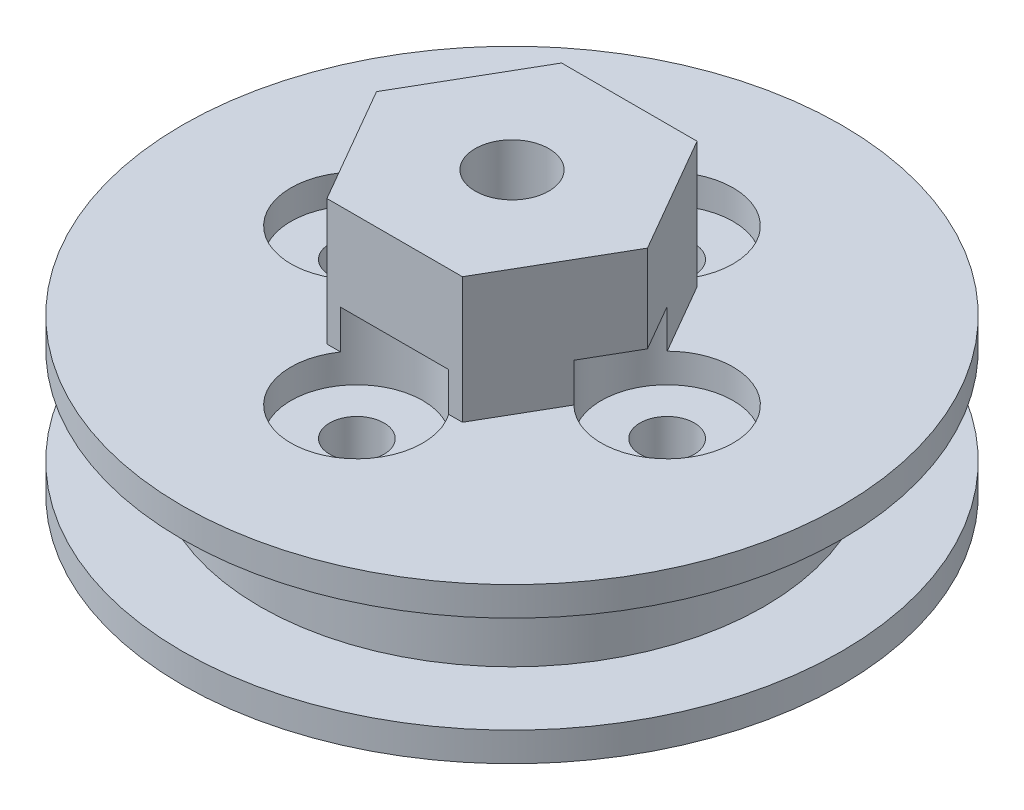
ISO-10303-21;
HEADER;
FILE_DESCRIPTION(('STEP AP214'),'2;1');
FILE_NAME('part.step','',(''),(''),'','','');
FILE_SCHEMA(('AUTOMOTIVE_DESIGN { 1 0 10303 214 1 1 1 1 }'));
ENDSEC;
DATA;
#1=APPLICATION_CONTEXT('core data for automotive mechanical design processes');
#2=APPLICATION_PROTOCOL_DEFINITION('international standard','automotive_design',2000,#1);
#3=PRODUCT_CONTEXT('',#1,'mechanical');
#4=PRODUCT('Part','Part','',(#3));
#5=PRODUCT_RELATED_PRODUCT_CATEGORY('part','',(#4));
#6=PRODUCT_DEFINITION_FORMATION('','',#4);
#7=PRODUCT_DEFINITION_CONTEXT('part definition',#1,'design');
#8=PRODUCT_DEFINITION('design','',#6,#7);
#9=PRODUCT_DEFINITION_SHAPE('','',#8);
#10=(LENGTH_UNIT() NAMED_UNIT(*) SI_UNIT(.MILLI.,.METRE.));
#11=(NAMED_UNIT(*) PLANE_ANGLE_UNIT() SI_UNIT($,.RADIAN.));
#12=(NAMED_UNIT(*) SI_UNIT($,.STERADIAN.) SOLID_ANGLE_UNIT());
#13=UNCERTAINTY_MEASURE_WITH_UNIT(LENGTH_MEASURE(1.E-05),#10,'distance_accuracy_value','');
#14=(GEOMETRIC_REPRESENTATION_CONTEXT(3) GLOBAL_UNCERTAINTY_ASSIGNED_CONTEXT((#13)) GLOBAL_UNIT_ASSIGNED_CONTEXT((#10,
#11,#12)) REPRESENTATION_CONTEXT('',''));
#15=CARTESIAN_POINT('',(0.,0.,0.));
#16=DIRECTION('',(0.,0.,1.));
#17=DIRECTION('',(1.,0.,0.));
#18=AXIS2_PLACEMENT_3D('',#15,#16,#17);
#19=CARTESIAN_POINT('',(0.,8.,0.));
#20=DIRECTION('',(0.,-1.,0.));
#21=DIRECTION('',(0.,0.,1.));
#22=AXIS2_PLACEMENT_3D('',#19,#20,#21);
#23=CYLINDRICAL_SURFACE('',#22,17.);
#24=CARTESIAN_POINT('',(0.,1.5,0.));
#25=DIRECTION('',(0.,-1.,0.));
#26=DIRECTION('',(0.,0.,-1.));
#27=AXIS2_PLACEMENT_3D('',#24,#25,#26);
#28=CIRCLE('',#27,17.);
#29=CARTESIAN_POINT('',(0.,1.5,-17.));
#30=VERTEX_POINT('',#29);
#31=EDGE_CURVE('E199',#30,#30,#28,.T.);
#32=ORIENTED_EDGE('',*,*,#31,.T.);
#33=EDGE_LOOP('',(#32));
#34=FACE_BOUND('',#33,.T.);
#35=CARTESIAN_POINT('',(0.,0.,0.));
#36=DIRECTION('',(0.,-1.,0.));
#37=DIRECTION('',(0.,0.,-1.));
#38=AXIS2_PLACEMENT_3D('',#35,#36,#37);
#39=CIRCLE('',#38,17.);
#40=CARTESIAN_POINT('',(0.,0.,-17.));
#41=VERTEX_POINT('',#40);
#42=EDGE_CURVE('E47',#41,#41,#39,.T.);
#43=ORIENTED_EDGE('',*,*,#42,.F.);
#44=EDGE_LOOP('',(#43));
#45=FACE_BOUND('',#44,.T.);
#46=ADVANCED_FACE('F43',(#34,#45),#23,.T.);
#47=CARTESIAN_POINT('',(0.,8.,8.));
#48=DIRECTION('',(0.,-1.,0.));
#49=DIRECTION('',(0.,0.,1.));
#50=AXIS2_PLACEMENT_3D('',#47,#48,#49);
#51=CYLINDRICAL_SURFACE('',#50,1.4);
#52=CARTESIAN_POINT('',(0.,0.,8.));
#53=DIRECTION('',(0.,-1.,0.));
#54=DIRECTION('',(0.,0.,-1.));
#55=AXIS2_PLACEMENT_3D('',#52,#53,#54);
#56=CIRCLE('',#55,1.4);
#57=CARTESIAN_POINT('',(0.,0.,6.6));
#58=VERTEX_POINT('',#57);
#59=EDGE_CURVE('E296',#58,#58,#56,.T.);
#60=ORIENTED_EDGE('',*,*,#59,.T.);
#61=EDGE_LOOP('',(#60));
#62=FACE_BOUND('',#61,.T.);
#63=CARTESIAN_POINT('',(0.,6.5,8.));
#64=DIRECTION('',(0.,-1.,0.));
#65=DIRECTION('',(0.,0.,-1.));
#66=AXIS2_PLACEMENT_3D('',#63,#64,#65);
#67=CIRCLE('',#66,1.4);
#68=CARTESIAN_POINT('',(0.,6.5,6.6));
#69=VERTEX_POINT('',#68);
#70=EDGE_CURVE('E281',#69,#69,#67,.F.);
#71=ORIENTED_EDGE('',*,*,#70,.T.);
#72=EDGE_LOOP('',(#71));
#73=FACE_BOUND('',#72,.T.);
#74=ADVANCED_FACE('F315',(#62,#73),#51,.F.);
#75=CARTESIAN_POINT('',(8.,8.,0.));
#76=DIRECTION('',(0.,-1.,0.));
#77=DIRECTION('',(0.,0.,1.));
#78=AXIS2_PLACEMENT_3D('',#75,#76,#77);
#79=CYLINDRICAL_SURFACE('',#78,1.4);
#80=CARTESIAN_POINT('',(8.,0.,0.));
#81=DIRECTION('',(0.,-1.,0.));
#82=DIRECTION('',(0.,0.,-1.));
#83=AXIS2_PLACEMENT_3D('',#80,#81,#82);
#84=CIRCLE('',#83,1.4);
#85=CARTESIAN_POINT('',(8.,0.,-1.40000000000003));
#86=VERTEX_POINT('',#85);
#87=EDGE_CURVE('E293',#86,#86,#84,.T.);
#88=ORIENTED_EDGE('',*,*,#87,.T.);
#89=EDGE_LOOP('',(#88));
#90=FACE_BOUND('',#89,.T.);
#91=CARTESIAN_POINT('',(8.,6.5,0.));
#92=DIRECTION('',(0.,-1.,0.));
#93=DIRECTION('',(0.,0.,-1.));
#94=AXIS2_PLACEMENT_3D('',#91,#92,#93);
#95=CIRCLE('',#94,1.4);
#96=CARTESIAN_POINT('',(8.,6.5,-1.40000000000003));
#97=VERTEX_POINT('',#96);
#98=EDGE_CURVE('E264',#97,#97,#95,.F.);
#99=ORIENTED_EDGE('',*,*,#98,.T.);
#100=EDGE_LOOP('',(#99));
#101=FACE_BOUND('',#100,.T.);
#102=ADVANCED_FACE('F320',(#90,#101),#79,.F.);
#103=CARTESIAN_POINT('',(4.51808198568511E-13,8.,-8.));
#104=DIRECTION('',(0.,-1.,0.));
#105=DIRECTION('',(0.,0.,1.));
#106=AXIS2_PLACEMENT_3D('',#103,#104,#105);
#107=CYLINDRICAL_SURFACE('',#106,1.4);
#108=CARTESIAN_POINT('',(4.51808198568511E-13,0.,-8.));
#109=DIRECTION('',(0.,-1.,0.));
#110=DIRECTION('',(0.,0.,-1.));
#111=AXIS2_PLACEMENT_3D('',#108,#109,#110);
#112=CIRCLE('',#111,1.4);
#113=CARTESIAN_POINT('',(4.51808198568511E-13,0.,-9.4));
#114=VERTEX_POINT('',#113);
#115=EDGE_CURVE('E290',#114,#114,#112,.T.);
#116=ORIENTED_EDGE('',*,*,#115,.T.);
#117=EDGE_LOOP('',(#116));
#118=FACE_BOUND('',#117,.T.);
#119=CARTESIAN_POINT('',(4.51808198568511E-13,6.5,-8.));
#120=DIRECTION('',(0.,-1.,0.));
#121=DIRECTION('',(0.,0.,-1.));
#122=AXIS2_PLACEMENT_3D('',#119,#120,#121);
#123=CIRCLE('',#122,1.4);
#124=CARTESIAN_POINT('',(4.51808198568511E-13,6.5,-9.4));
#125=VERTEX_POINT('',#124);
#126=EDGE_CURVE('E256',#125,#125,#123,.F.);
#127=ORIENTED_EDGE('',*,*,#126,.T.);
#128=EDGE_LOOP('',(#127));
#129=FACE_BOUND('',#128,.T.);
#130=ADVANCED_FACE('F441',(#118,#129),#107,.F.);
#131=CARTESIAN_POINT('',(-7.99999999999977,8.,-2.26883816723573E-13));
#132=DIRECTION('',(0.,-1.,0.));
#133=DIRECTION('',(0.,0.,1.));
#134=AXIS2_PLACEMENT_3D('',#131,#132,#133);
#135=CYLINDRICAL_SURFACE('',#134,1.4);
#136=CARTESIAN_POINT('',(-7.99999999999977,0.,-2.26883816723573E-13));
#137=DIRECTION('',(0.,-1.,0.));
#138=DIRECTION('',(0.,0.,-1.));
#139=AXIS2_PLACEMENT_3D('',#136,#137,#138);
#140=CIRCLE('',#139,1.4);
#141=CARTESIAN_POINT('',(-7.99999999999977,0.,-1.40000000000023));
#142=VERTEX_POINT('',#141);
#143=EDGE_CURVE('E263',#142,#142,#140,.T.);
#144=ORIENTED_EDGE('',*,*,#143,.T.);
#145=EDGE_LOOP('',(#144));
#146=FACE_BOUND('',#145,.T.);
#147=CARTESIAN_POINT('',(-7.99999999999977,6.5,-2.26883816723573E-13));
#148=DIRECTION('',(0.,-1.,0.));
#149=DIRECTION('',(0.,0.,-1.));
#150=AXIS2_PLACEMENT_3D('',#147,#148,#149);
#151=CIRCLE('',#150,1.4);
#152=CARTESIAN_POINT('',(-7.99999999999977,6.5,-1.40000000000023));
#153=VERTEX_POINT('',#152);
#154=EDGE_CURVE('E273',#153,#153,#151,.F.);
#155=ORIENTED_EDGE('',*,*,#154,.T.);
#156=EDGE_LOOP('',(#155));
#157=FACE_BOUND('',#156,.T.);
#158=ADVANCED_FACE('F438',(#146,#157),#135,.F.);
#159=CARTESIAN_POINT('',(0.,8.,0.));
#160=DIRECTION('',(0.,1.,0.));
#161=DIRECTION('',(0.,0.,-1.));
#162=AXIS2_PLACEMENT_3D('',#159,#160,#161);
#163=PLANE('',#162);
#164=DIRECTION('',(1.,0.,0.));
#165=VECTOR('',#164,1.);
#166=CARTESIAN_POINT('',(-3.49296912859723,8.,-6.05));
#167=LINE('',#166,#165);
#168=CARTESIAN_POINT('',(-3.49296912859723,8.,-6.05));
#169=VERTEX_POINT('',#168);
#170=CARTESIAN_POINT('',(-2.78522889544064,8.,-6.05));
#171=VERTEX_POINT('',#170);
#172=EDGE_CURVE('E204',#169,#171,#167,.T.);
#173=ORIENTED_EDGE('',*,*,#172,.T.);
#174=CARTESIAN_POINT('',(4.51808198568511E-13,8.,-8.));
#175=DIRECTION('',(0.,-1.,0.));
#176=DIRECTION('',(0.,0.,-1.));
#177=AXIS2_PLACEMENT_3D('',#174,#175,#176);
#178=CIRCLE('',#177,3.4);
#179=CARTESIAN_POINT('',(2.78522889544154,8.,-6.05));
#180=VERTEX_POINT('',#179);
#181=EDGE_CURVE('E257',#171,#180,#178,.T.);
#182=ORIENTED_EDGE('',*,*,#181,.T.);
#183=CARTESIAN_POINT('',(3.49296912859723,8.,-6.05));
#184=VERTEX_POINT('',#183);
#185=EDGE_CURVE('E229',#180,#184,#167,.T.);
#186=ORIENTED_EDGE('',*,*,#185,.T.);
#187=DIRECTION('',(0.5,0.,0.866025403784438));
#188=VECTOR('',#187,1.);
#189=CARTESIAN_POINT('',(3.49296912859723,8.,-6.05));
#190=LINE('',#189,#188);
#191=CARTESIAN_POINT('',(5.59714136828051,8.,-2.40546677299257));
#192=VERTEX_POINT('',#191);
#193=EDGE_CURVE('E228',#184,#192,#190,.T.);
#194=ORIENTED_EDGE('',*,*,#193,.T.);
#195=CARTESIAN_POINT('',(8.,8.,0.));
#196=DIRECTION('',(0.,-1.,0.));
#197=DIRECTION('',(0.,0.,-1.));
#198=AXIS2_PLACEMENT_3D('',#195,#196,#197);
#199=CIRCLE('',#198,3.4);
#200=CARTESIAN_POINT('',(5.59714136828053,8.,2.40546677299253));
#201=VERTEX_POINT('',#200);
#202=EDGE_CURVE('E260',#192,#201,#199,.T.);
#203=ORIENTED_EDGE('',*,*,#202,.T.);
#204=DIRECTION('',(-0.5,0.,0.866025403784438));
#205=VECTOR('',#204,1.);
#206=CARTESIAN_POINT('',(6.98593825719447,8.,0.));
#207=LINE('',#206,#205);
#208=CARTESIAN_POINT('',(3.49296912859723,8.,6.05));
#209=VERTEX_POINT('',#208);
#210=EDGE_CURVE('E233',#201,#209,#207,.T.);
#211=ORIENTED_EDGE('',*,*,#210,.T.);
#212=DIRECTION('',(-1.,0.,0.));
#213=VECTOR('',#212,1.);
#214=CARTESIAN_POINT('',(3.49296912859723,8.,6.05));
#215=LINE('',#214,#213);
#216=CARTESIAN_POINT('',(2.78522889544109,8.,6.05));
#217=VERTEX_POINT('',#216);
#218=EDGE_CURVE('E232',#209,#217,#215,.T.);
#219=ORIENTED_EDGE('',*,*,#218,.T.);
#220=CARTESIAN_POINT('',(0.,8.,8.));
#221=DIRECTION('',(0.,-1.,0.));
#222=DIRECTION('',(0.,0.,-1.));
#223=AXIS2_PLACEMENT_3D('',#220,#221,#222);
#224=CIRCLE('',#223,3.4);
#225=CARTESIAN_POINT('',(-2.78522889544109,8.,6.05));
#226=VERTEX_POINT('',#225);
#227=EDGE_CURVE('E165',#217,#226,#224,.T.);
#228=ORIENTED_EDGE('',*,*,#227,.T.);
#229=CARTESIAN_POINT('',(-3.49296912859724,8.,6.05));
#230=VERTEX_POINT('',#229);
#231=EDGE_CURVE('E52',#226,#230,#215,.T.);
#232=ORIENTED_EDGE('',*,*,#231,.T.);
#233=DIRECTION('',(-0.5,0.,-0.866025403784438));
#234=VECTOR('',#233,1.);
#235=CARTESIAN_POINT('',(-3.49296912859724,8.,6.05));
#236=LINE('',#235,#234);
#237=CARTESIAN_POINT('',(-5.59714136828052,8.,2.40546677299255));
#238=VERTEX_POINT('',#237);
#239=EDGE_CURVE('E210',#230,#238,#236,.T.);
#240=ORIENTED_EDGE('',*,*,#239,.T.);
#241=CARTESIAN_POINT('',(-7.99999999999977,8.,-2.26883816723573E-13));
#242=DIRECTION('',(0.,-1.,0.));
#243=DIRECTION('',(0.,0.,-1.));
#244=AXIS2_PLACEMENT_3D('',#241,#242,#243);
#245=CIRCLE('',#244,3.4);
#246=CARTESIAN_POINT('',(-5.59714136828036,8.,-2.40546677299284));
#247=VERTEX_POINT('',#246);
#248=EDGE_CURVE('E268',#238,#247,#245,.T.);
#249=ORIENTED_EDGE('',*,*,#248,.T.);
#250=DIRECTION('',(0.5,0.,-0.866025403784438));
#251=VECTOR('',#250,1.);
#252=CARTESIAN_POINT('',(-6.98593825719447,8.,0.));
#253=LINE('',#252,#251);
#254=EDGE_CURVE('E12',#247,#169,#253,.T.);
#255=ORIENTED_EDGE('',*,*,#254,.T.);
#256=EDGE_LOOP('',(#173,#182,#186,#194,#203,#211,#219,#228,#232,#240,#249,#255));
#257=FACE_BOUND('',#256,.T.);
#258=CARTESIAN_POINT('',(0.,8.,0.));
#259=DIRECTION('',(0.,-1.,0.));
#260=DIRECTION('',(0.,0.,-1.));
#261=AXIS2_PLACEMENT_3D('',#258,#259,#260);
#262=CIRCLE('',#261,17.);
#263=CARTESIAN_POINT('',(0.,8.,-17.));
#264=VERTEX_POINT('',#263);
#265=EDGE_CURVE('E303',#264,#264,#262,.T.);
#266=ORIENTED_EDGE('',*,*,#265,.F.);
#267=EDGE_LOOP('',(#266));
#268=FACE_BOUND('',#267,.T.);
#269=ADVANCED_FACE('F334',(#257,#268),#163,.T.);
#270=CARTESIAN_POINT('',(0.,0.,0.));
#271=DIRECTION('',(0.,1.,0.));
#272=DIRECTION('',(0.,0.,-1.));
#273=AXIS2_PLACEMENT_3D('',#270,#271,#272);
#274=PLANE('',#273);
#275=ORIENTED_EDGE('',*,*,#42,.T.);
#276=EDGE_LOOP('',(#275));
#277=FACE_BOUND('',#276,.T.);
#278=CARTESIAN_POINT('',(0.,0.,0.));
#279=DIRECTION('',(0.,-1.,0.));
#280=DIRECTION('',(0.,0.,-1.));
#281=AXIS2_PLACEMENT_3D('',#278,#279,#280);
#282=CIRCLE('',#281,4.3);
#283=CARTESIAN_POINT('',(0.,0.,-4.3));
#284=VERTEX_POINT('',#283);
#285=EDGE_CURVE('E299',#284,#284,#282,.T.);
#286=ORIENTED_EDGE('',*,*,#285,.F.);
#287=EDGE_LOOP('',(#286));
#288=FACE_BOUND('',#287,.T.);
#289=ORIENTED_EDGE('',*,*,#59,.F.);
#290=EDGE_LOOP('',(#289));
#291=FACE_BOUND('',#290,.T.);
#292=ORIENTED_EDGE('',*,*,#87,.F.);
#293=EDGE_LOOP('',(#292));
#294=FACE_BOUND('',#293,.T.);
#295=ORIENTED_EDGE('',*,*,#115,.F.);
#296=EDGE_LOOP('',(#295));
#297=FACE_BOUND('',#296,.T.);
#298=ORIENTED_EDGE('',*,*,#143,.F.);
#299=EDGE_LOOP('',(#298));
#300=FACE_BOUND('',#299,.T.);
#301=ADVANCED_FACE('F311',(#277,#288,#291,#294,#297,#300),#274,.F.);
#302=CARTESIAN_POINT('',(0.,6.5,0.));
#303=DIRECTION('',(0.,-1.,0.));
#304=DIRECTION('',(0.,0.,-1.));
#305=AXIS2_PLACEMENT_3D('',#302,#303,#304);
#306=CIRCLE('',#305,17.);
#307=CARTESIAN_POINT('',(0.,6.5,-17.));
#308=VERTEX_POINT('',#307);
#309=EDGE_CURVE('E337',#308,#308,#306,.T.);
#310=ORIENTED_EDGE('',*,*,#309,.F.);
#311=EDGE_LOOP('',(#310));
#312=FACE_BOUND('',#311,.T.);
#313=ORIENTED_EDGE('',*,*,#265,.T.);
#314=EDGE_LOOP('',(#313));
#315=FACE_BOUND('',#314,.T.);
#316=ADVANCED_FACE('F45',(#312,#315),#23,.T.);
#317=CARTESIAN_POINT('',(0.,8.,0.));
#318=DIRECTION('',(0.,-1.,0.));
#319=DIRECTION('',(0.,0.,1.));
#320=AXIS2_PLACEMENT_3D('',#317,#318,#319);
#321=CYLINDRICAL_SURFACE('',#320,4.3);
#322=CARTESIAN_POINT('',(0.,8.,0.));
#323=DIRECTION('',(0.,-1.,0.));
#324=DIRECTION('',(0.,0.,-1.));
#325=AXIS2_PLACEMENT_3D('',#322,#323,#324);
#326=CIRCLE('',#325,4.3);
#327=CARTESIAN_POINT('',(0.,8.,-4.3));
#328=VERTEX_POINT('',#327);
#329=EDGE_CURVE('E252',#328,#328,#326,.T.);
#330=ORIENTED_EDGE('',*,*,#329,.F.);
#331=EDGE_LOOP('',(#330));
#332=FACE_BOUND('',#331,.T.);
#333=ORIENTED_EDGE('',*,*,#285,.T.);
#334=EDGE_LOOP('',(#333));
#335=FACE_BOUND('',#334,.T.);
#336=ADVANCED_FACE('F325',(#332,#335),#321,.F.);
#337=CARTESIAN_POINT('',(-7.99999999999977,-9.61665222413705,-2.26883816723573E-13));
#338=DIRECTION('',(0.,1.,0.));
#339=DIRECTION('',(0.,0.,-1.));
#340=AXIS2_PLACEMENT_3D('',#337,#338,#339);
#341=CYLINDRICAL_SURFACE('',#340,3.4);
#342=CARTESIAN_POINT('',(-7.99999999999977,6.5,-2.26883816723573E-13));
#343=DIRECTION('',(0.,-1.,0.));
#344=DIRECTION('',(0.,0.,-1.));
#345=AXIS2_PLACEMENT_3D('',#342,#343,#344);
#346=CIRCLE('',#345,3.4);
#347=CARTESIAN_POINT('',(-7.99999999999977,6.5,-3.40000000000023));
#348=VERTEX_POINT('',#347);
#349=EDGE_CURVE('E276',#348,#348,#346,.F.);
#350=ORIENTED_EDGE('',*,*,#349,.F.);
#351=EDGE_LOOP('',(#350));
#352=FACE_BOUND('',#351,.T.);
#353=ORIENTED_EDGE('',*,*,#248,.F.);
#354=DIRECTION('',(0.,-1.,0.));
#355=VECTOR('',#354,1.);
#356=CARTESIAN_POINT('',(-5.59714136828052,10.,2.40546677299255));
#357=LINE('',#356,#355);
#358=CARTESIAN_POINT('',(-5.59714136828052,10.,2.40546677299255));
#359=VERTEX_POINT('',#358);
#360=EDGE_CURVE('E187',#359,#238,#357,.T.);
#361=ORIENTED_EDGE('',*,*,#360,.F.);
#362=CARTESIAN_POINT('',(-7.99999999999977,10.,-2.26883816723573E-13));
#363=DIRECTION('',(0.,1.,0.));
#364=DIRECTION('',(0.,0.,1.));
#365=AXIS2_PLACEMENT_3D('',#362,#363,#364);
#366=CIRCLE('',#365,3.4);
#367=CARTESIAN_POINT('',(-5.59714136828036,10.,-2.40546677299284));
#368=VERTEX_POINT('',#367);
#369=EDGE_CURVE('E179',#359,#368,#366,.T.);
#370=ORIENTED_EDGE('',*,*,#369,.T.);
#371=DIRECTION('',(0.,-1.,0.));
#372=VECTOR('',#371,1.);
#373=CARTESIAN_POINT('',(-5.59714136828036,10.,-2.40546677299284));
#374=LINE('',#373,#372);
#375=EDGE_CURVE('E184',#368,#247,#374,.T.);
#376=ORIENTED_EDGE('',*,*,#375,.T.);
#377=EDGE_LOOP('',(#353,#361,#370,#376));
#378=FACE_BOUND('',#377,.T.);
#379=ADVANCED_FACE('F331',(#352,#378),#341,.F.);
#380=CARTESIAN_POINT('',(0.,6.5,0.));
#381=DIRECTION('',(0.,1.,0.));
#382=DIRECTION('',(0.,0.,-1.));
#383=AXIS2_PLACEMENT_3D('',#380,#381,#382);
#384=PLANE('',#383);
#385=ORIENTED_EDGE('',*,*,#349,.T.);
#386=EDGE_LOOP('',(#385));
#387=FACE_BOUND('',#386,.T.);
#388=ORIENTED_EDGE('',*,*,#154,.F.);
#389=EDGE_LOOP('',(#388));
#390=FACE_BOUND('',#389,.T.);
#391=ADVANCED_FACE('F417',(#387,#390),#384,.T.);
#392=CARTESIAN_POINT('',(4.51808198568511E-13,-9.61665222413705,-8.));
#393=DIRECTION('',(0.,1.,0.));
#394=DIRECTION('',(0.,0.,-1.));
#395=AXIS2_PLACEMENT_3D('',#392,#393,#394);
#396=CYLINDRICAL_SURFACE('',#395,3.4);
#397=CARTESIAN_POINT('',(4.51808198568511E-13,6.5,-8.));
#398=DIRECTION('',(0.,-1.,0.));
#399=DIRECTION('',(0.,0.,-1.));
#400=AXIS2_PLACEMENT_3D('',#397,#398,#399);
#401=CIRCLE('',#400,3.4);
#402=CARTESIAN_POINT('',(4.51808198568511E-13,6.5,-11.4));
#403=VERTEX_POINT('',#402);
#404=EDGE_CURVE('E253',#403,#403,#401,.F.);
#405=ORIENTED_EDGE('',*,*,#404,.F.);
#406=EDGE_LOOP('',(#405));
#407=FACE_BOUND('',#406,.T.);
#408=ORIENTED_EDGE('',*,*,#181,.F.);
#409=DIRECTION('',(0.,-1.,0.));
#410=VECTOR('',#409,1.);
#411=CARTESIAN_POINT('',(-2.78522889544064,10.,-6.05));
#412=LINE('',#411,#410);
#413=CARTESIAN_POINT('',(-2.78522889544064,10.,-6.05));
#414=VERTEX_POINT('',#413);
#415=EDGE_CURVE('E197',#414,#171,#412,.T.);
#416=ORIENTED_EDGE('',*,*,#415,.F.);
#417=CARTESIAN_POINT('',(4.51808198568511E-13,10.,-8.));
#418=DIRECTION('',(0.,1.,0.));
#419=DIRECTION('',(0.,0.,1.));
#420=AXIS2_PLACEMENT_3D('',#417,#418,#419);
#421=CIRCLE('',#420,3.4);
#422=CARTESIAN_POINT('',(2.78522889544154,10.,-6.05));
#423=VERTEX_POINT('',#422);
#424=EDGE_CURVE('E189',#414,#423,#421,.T.);
#425=ORIENTED_EDGE('',*,*,#424,.T.);
#426=DIRECTION('',(0.,-1.,0.));
#427=VECTOR('',#426,1.);
#428=CARTESIAN_POINT('',(2.78522889544154,10.,-6.05));
#429=LINE('',#428,#427);
#430=EDGE_CURVE('E195',#423,#180,#429,.T.);
#431=ORIENTED_EDGE('',*,*,#430,.T.);
#432=EDGE_LOOP('',(#408,#416,#425,#431));
#433=FACE_BOUND('',#432,.T.);
#434=ADVANCED_FACE('F413',(#407,#433),#396,.F.);
#435=CARTESIAN_POINT('',(0.,6.5,0.));
#436=DIRECTION('',(0.,1.,0.));
#437=DIRECTION('',(0.,0.,-1.));
#438=AXIS2_PLACEMENT_3D('',#435,#436,#437);
#439=PLANE('',#438);
#440=ORIENTED_EDGE('',*,*,#404,.T.);
#441=EDGE_LOOP('',(#440));
#442=FACE_BOUND('',#441,.T.);
#443=ORIENTED_EDGE('',*,*,#126,.F.);
#444=EDGE_LOOP('',(#443));
#445=FACE_BOUND('',#444,.T.);
#446=ADVANCED_FACE('F409',(#442,#445),#439,.T.);
#447=CARTESIAN_POINT('',(8.,-9.61665222413705,0.));
#448=DIRECTION('',(0.,1.,0.));
#449=DIRECTION('',(0.,0.,-1.));
#450=AXIS2_PLACEMENT_3D('',#447,#448,#449);
#451=CYLINDRICAL_SURFACE('',#450,3.4);
#452=CARTESIAN_POINT('',(8.,6.5,0.));
#453=DIRECTION('',(0.,-1.,0.));
#454=DIRECTION('',(0.,0.,-1.));
#455=AXIS2_PLACEMENT_3D('',#452,#453,#454);
#456=CIRCLE('',#455,3.4);
#457=CARTESIAN_POINT('',(8.,6.5,-3.40000000000003));
#458=VERTEX_POINT('',#457);
#459=EDGE_CURVE('E267',#458,#458,#456,.F.);
#460=ORIENTED_EDGE('',*,*,#459,.F.);
#461=EDGE_LOOP('',(#460));
#462=FACE_BOUND('',#461,.T.);
#463=ORIENTED_EDGE('',*,*,#202,.F.);
#464=DIRECTION('',(0.,-1.,0.));
#465=VECTOR('',#464,1.);
#466=CARTESIAN_POINT('',(5.59714136828051,10.,-2.40546677299257));
#467=LINE('',#466,#465);
#468=CARTESIAN_POINT('',(5.59714136828051,10.,-2.40546677299257));
#469=VERTEX_POINT('',#468);
#470=EDGE_CURVE('E177',#469,#192,#467,.T.);
#471=ORIENTED_EDGE('',*,*,#470,.F.);
#472=CARTESIAN_POINT('',(8.,10.,0.));
#473=DIRECTION('',(0.,1.,0.));
#474=DIRECTION('',(0.,0.,1.));
#475=AXIS2_PLACEMENT_3D('',#472,#473,#474);
#476=CIRCLE('',#475,3.4);
#477=CARTESIAN_POINT('',(5.59714136828053,10.,2.40546677299253));
#478=VERTEX_POINT('',#477);
#479=EDGE_CURVE('E161',#469,#478,#476,.T.);
#480=ORIENTED_EDGE('',*,*,#479,.T.);
#481=DIRECTION('',(0.,-1.,0.));
#482=VECTOR('',#481,1.);
#483=CARTESIAN_POINT('',(5.59714136828053,10.,2.40546677299253));
#484=LINE('',#483,#482);
#485=EDGE_CURVE('E174',#478,#201,#484,.T.);
#486=ORIENTED_EDGE('',*,*,#485,.T.);
#487=EDGE_LOOP('',(#463,#471,#480,#486));
#488=FACE_BOUND('',#487,.T.);
#489=ADVANCED_FACE('F412',(#462,#488),#451,.F.);
#490=CARTESIAN_POINT('',(0.,6.5,0.));
#491=DIRECTION('',(0.,1.,0.));
#492=DIRECTION('',(0.,0.,-1.));
#493=AXIS2_PLACEMENT_3D('',#490,#491,#492);
#494=PLANE('',#493);
#495=ORIENTED_EDGE('',*,*,#459,.T.);
#496=EDGE_LOOP('',(#495));
#497=FACE_BOUND('',#496,.T.);
#498=ORIENTED_EDGE('',*,*,#98,.F.);
#499=EDGE_LOOP('',(#498));
#500=FACE_BOUND('',#499,.T.);
#501=ADVANCED_FACE('F421',(#497,#500),#494,.T.);
#502=CARTESIAN_POINT('',(0.,-9.61665222413705,8.));
#503=DIRECTION('',(0.,1.,0.));
#504=DIRECTION('',(0.,0.,-1.));
#505=AXIS2_PLACEMENT_3D('',#502,#503,#504);
#506=CYLINDRICAL_SURFACE('',#505,3.4);
#507=CARTESIAN_POINT('',(0.,6.5,8.));
#508=DIRECTION('',(0.,-1.,0.));
#509=DIRECTION('',(0.,0.,-1.));
#510=AXIS2_PLACEMENT_3D('',#507,#508,#509);
#511=CIRCLE('',#510,3.4);
#512=CARTESIAN_POINT('',(0.,6.5,4.6));
#513=VERTEX_POINT('',#512);
#514=EDGE_CURVE('E284',#513,#513,#511,.F.);
#515=ORIENTED_EDGE('',*,*,#514,.F.);
#516=EDGE_LOOP('',(#515));
#517=FACE_BOUND('',#516,.T.);
#518=ORIENTED_EDGE('',*,*,#227,.F.);
#519=DIRECTION('',(0.,-1.,0.));
#520=VECTOR('',#519,1.);
#521=CARTESIAN_POINT('',(2.78522889544109,10.,6.05));
#522=LINE('',#521,#520);
#523=CARTESIAN_POINT('',(2.78522889544109,10.,6.05));
#524=VERTEX_POINT('',#523);
#525=EDGE_CURVE('E151',#524,#217,#522,.T.);
#526=ORIENTED_EDGE('',*,*,#525,.F.);
#527=CARTESIAN_POINT('',(0.,10.,8.));
#528=DIRECTION('',(0.,1.,0.));
#529=DIRECTION('',(0.,0.,1.));
#530=AXIS2_PLACEMENT_3D('',#527,#528,#529);
#531=CIRCLE('',#530,3.4);
#532=CARTESIAN_POINT('',(-2.78522889544109,10.,6.05));
#533=VERTEX_POINT('',#532);
#534=EDGE_CURVE('E157',#524,#533,#531,.T.);
#535=ORIENTED_EDGE('',*,*,#534,.T.);
#536=DIRECTION('',(0.,-1.,0.));
#537=VECTOR('',#536,1.);
#538=CARTESIAN_POINT('',(-2.78522889544109,10.,6.05));
#539=LINE('',#538,#537);
#540=EDGE_CURVE('E154',#533,#226,#539,.T.);
#541=ORIENTED_EDGE('',*,*,#540,.T.);
#542=EDGE_LOOP('',(#518,#526,#535,#541));
#543=FACE_BOUND('',#542,.T.);
#544=ADVANCED_FACE('F163',(#517,#543),#506,.F.);
#545=CARTESIAN_POINT('',(0.,6.5,0.));
#546=DIRECTION('',(0.,1.,0.));
#547=DIRECTION('',(0.,0.,-1.));
#548=AXIS2_PLACEMENT_3D('',#545,#546,#547);
#549=PLANE('',#548);
#550=ORIENTED_EDGE('',*,*,#514,.T.);
#551=EDGE_LOOP('',(#550));
#552=FACE_BOUND('',#551,.T.);
#553=ORIENTED_EDGE('',*,*,#70,.F.);
#554=EDGE_LOOP('',(#553));
#555=FACE_BOUND('',#554,.T.);
#556=ADVANCED_FACE('F383',(#552,#555),#549,.T.);
#557=CARTESIAN_POINT('',(0.,14.5,0.));
#558=DIRECTION('',(0.,1.,0.));
#559=DIRECTION('',(0.,0.,-1.));
#560=AXIS2_PLACEMENT_3D('',#557,#558,#559);
#561=PLANE('',#560);
#562=DIRECTION('',(1.,0.,0.));
#563=VECTOR('',#562,1.);
#564=CARTESIAN_POINT('',(-3.49296912859723,14.5,-6.05));
#565=LINE('',#564,#563);
#566=CARTESIAN_POINT('',(-3.49296912859723,14.5,-6.05));
#567=VERTEX_POINT('',#566);
#568=CARTESIAN_POINT('',(3.49296912859723,14.5,-6.05));
#569=VERTEX_POINT('',#568);
#570=EDGE_CURVE('E206',#567,#569,#565,.T.);
#571=ORIENTED_EDGE('',*,*,#570,.F.);
#572=DIRECTION('',(0.5,0.,-0.866025403784438));
#573=VECTOR('',#572,1.);
#574=CARTESIAN_POINT('',(-6.98593825719447,14.5,0.));
#575=LINE('',#574,#573);
#576=CARTESIAN_POINT('',(-6.98593825719447,14.5,0.));
#577=VERTEX_POINT('',#576);
#578=EDGE_CURVE('E222',#577,#567,#575,.T.);
#579=ORIENTED_EDGE('',*,*,#578,.F.);
#580=DIRECTION('',(-0.5,0.,-0.866025403784438));
#581=VECTOR('',#580,1.);
#582=CARTESIAN_POINT('',(-3.49296912859724,14.5,6.05));
#583=LINE('',#582,#581);
#584=CARTESIAN_POINT('',(-3.49296912859724,14.5,6.05));
#585=VERTEX_POINT('',#584);
#586=EDGE_CURVE('E219',#585,#577,#583,.T.);
#587=ORIENTED_EDGE('',*,*,#586,.F.);
#588=DIRECTION('',(-1.,0.,0.));
#589=VECTOR('',#588,1.);
#590=CARTESIAN_POINT('',(3.49296912859723,14.5,6.05));
#591=LINE('',#590,#589);
#592=CARTESIAN_POINT('',(3.49296912859723,14.5,6.05));
#593=VERTEX_POINT('',#592);
#594=EDGE_CURVE('E216',#593,#585,#591,.T.);
#595=ORIENTED_EDGE('',*,*,#594,.F.);
#596=DIRECTION('',(-0.5,0.,0.866025403784438));
#597=VECTOR('',#596,1.);
#598=CARTESIAN_POINT('',(6.98593825719447,14.5,0.));
#599=LINE('',#598,#597);
#600=CARTESIAN_POINT('',(6.98593825719447,14.5,0.));
#601=VERTEX_POINT('',#600);
#602=EDGE_CURVE('E213',#601,#593,#599,.T.);
#603=ORIENTED_EDGE('',*,*,#602,.F.);
#604=DIRECTION('',(0.5,0.,0.866025403784438));
#605=VECTOR('',#604,1.);
#606=CARTESIAN_POINT('',(3.49296912859723,14.5,-6.05));
#607=LINE('',#606,#605);
#608=EDGE_CURVE('E209',#569,#601,#607,.T.);
#609=ORIENTED_EDGE('',*,*,#608,.F.);
#610=EDGE_LOOP('',(#571,#579,#587,#595,#603,#609));
#611=FACE_BOUND('',#610,.T.);
#612=CARTESIAN_POINT('',(0.,14.5,0.));
#613=DIRECTION('',(0.,-1.,0.));
#614=DIRECTION('',(0.,0.,-1.));
#615=AXIS2_PLACEMENT_3D('',#612,#613,#614);
#616=CIRCLE('',#615,1.9);
#617=CARTESIAN_POINT('',(0.,14.5,1.9));
#618=VERTEX_POINT('',#617);
#619=EDGE_CURVE('E170',#618,#618,#616,.T.);
#620=ORIENTED_EDGE('',*,*,#619,.T.);
#621=EDGE_LOOP('',(#620));
#622=FACE_BOUND('',#621,.T.);
#623=ADVANCED_FACE('F379',(#611,#622),#561,.T.);
#624=CARTESIAN_POINT('',(0.,8.,0.));
#625=DIRECTION('',(0.,1.,0.));
#626=DIRECTION('',(0.,0.,-1.));
#627=AXIS2_PLACEMENT_3D('',#624,#625,#626);
#628=PLANE('',#627);
#629=ORIENTED_EDGE('',*,*,#329,.T.);
#630=EDGE_LOOP('',(#629));
#631=FACE_BOUND('',#630,.T.);
#632=CARTESIAN_POINT('',(0.,8.,0.));
#633=DIRECTION('',(0.,-1.,0.));
#634=DIRECTION('',(0.,0.,-1.));
#635=AXIS2_PLACEMENT_3D('',#632,#633,#634);
#636=CIRCLE('',#635,1.9);
#637=CARTESIAN_POINT('',(0.,8.,1.9));
#638=VERTEX_POINT('',#637);
#639=EDGE_CURVE('E167',#638,#638,#636,.T.);
#640=ORIENTED_EDGE('',*,*,#639,.F.);
#641=EDGE_LOOP('',(#640));
#642=FACE_BOUND('',#641,.T.);
#643=ADVANCED_FACE('F382',(#631,#642),#628,.F.);
#644=CARTESIAN_POINT('',(-3.49296912859723,14.5,-6.05));
#645=DIRECTION('',(0.,0.,1.));
#646=DIRECTION('',(-1.,0.,0.));
#647=AXIS2_PLACEMENT_3D('',#644,#645,#646);
#648=PLANE('',#647);
#649=DIRECTION('',(-1.,0.,0.));
#650=VECTOR('',#649,1.);
#651=CARTESIAN_POINT('',(2.78522889544154,10.,-6.05));
#652=LINE('',#651,#650);
#653=EDGE_CURVE('E59',#423,#414,#652,.T.);
#654=ORIENTED_EDGE('',*,*,#653,.T.);
#655=ORIENTED_EDGE('',*,*,#415,.T.);
#656=ORIENTED_EDGE('',*,*,#172,.F.);
#657=DIRECTION('',(0.,-1.,0.));
#658=VECTOR('',#657,1.);
#659=CARTESIAN_POINT('',(-3.49296912859723,14.5,-6.05));
#660=LINE('',#659,#658);
#661=EDGE_CURVE('E225',#567,#169,#660,.T.);
#662=ORIENTED_EDGE('',*,*,#661,.F.);
#663=ORIENTED_EDGE('',*,*,#570,.T.);
#664=DIRECTION('',(0.,-1.,0.));
#665=VECTOR('',#664,1.);
#666=CARTESIAN_POINT('',(3.49296912859723,14.5,-6.05));
#667=LINE('',#666,#665);
#668=EDGE_CURVE('E250',#569,#184,#667,.T.);
#669=ORIENTED_EDGE('',*,*,#668,.T.);
#670=ORIENTED_EDGE('',*,*,#185,.F.);
#671=ORIENTED_EDGE('',*,*,#430,.F.);
#672=EDGE_LOOP('',(#654,#655,#656,#662,#663,#669,#670,#671));
#673=FACE_BOUND('',#672,.T.);
#674=ADVANCED_FACE('F387',(#673),#648,.F.);
#675=CARTESIAN_POINT('',(3.49296912859723,14.5,-6.05));
#676=DIRECTION('',(-0.866025403784438,0.,0.5));
#677=DIRECTION('',(-0.5,0.,-0.866025403784439));
#678=AXIS2_PLACEMENT_3D('',#675,#676,#677);
#679=PLANE('',#678);
#680=ORIENTED_EDGE('',*,*,#193,.F.);
#681=ORIENTED_EDGE('',*,*,#668,.F.);
#682=ORIENTED_EDGE('',*,*,#608,.T.);
#683=DIRECTION('',(0.,-1.,0.));
#684=VECTOR('',#683,1.);
#685=CARTESIAN_POINT('',(6.98593825719447,14.5,0.));
#686=LINE('',#685,#684);
#687=CARTESIAN_POINT('',(6.98593825719447,10.,0.));
#688=VERTEX_POINT('',#687);
#689=EDGE_CURVE('E247',#601,#688,#686,.T.);
#690=ORIENTED_EDGE('',*,*,#689,.T.);
#691=DIRECTION('',(-0.5,0.,-0.866025403784439));
#692=VECTOR('',#691,1.);
#693=CARTESIAN_POINT('',(6.98593825719447,10.,0.));
#694=LINE('',#693,#692);
#695=EDGE_CURVE('E176',#688,#469,#694,.T.);
#696=ORIENTED_EDGE('',*,*,#695,.T.);
#697=ORIENTED_EDGE('',*,*,#470,.T.);
#698=EDGE_LOOP('',(#680,#681,#682,#690,#696,#697));
#699=FACE_BOUND('',#698,.T.);
#700=ADVANCED_FACE('F401',(#699),#679,.F.);
#701=CARTESIAN_POINT('',(6.98593825719447,14.5,0.));
#702=DIRECTION('',(-0.866025403784438,0.,-0.5));
#703=DIRECTION('',(0.5,0.,-0.866025403784438));
#704=AXIS2_PLACEMENT_3D('',#701,#702,#703);
#705=PLANE('',#704);
#706=DIRECTION('',(0.5,0.,-0.866025403784438));
#707=VECTOR('',#706,1.);
#708=CARTESIAN_POINT('',(5.59714136828053,10.,2.40546677299253));
#709=LINE('',#708,#707);
#710=EDGE_CURVE('E67',#478,#688,#709,.T.);
#711=ORIENTED_EDGE('',*,*,#710,.T.);
#712=ORIENTED_EDGE('',*,*,#689,.F.);
#713=ORIENTED_EDGE('',*,*,#602,.T.);
#714=DIRECTION('',(0.,-1.,0.));
#715=VECTOR('',#714,1.);
#716=CARTESIAN_POINT('',(3.49296912859723,14.5,6.05));
#717=LINE('',#716,#715);
#718=EDGE_CURVE('E245',#593,#209,#717,.T.);
#719=ORIENTED_EDGE('',*,*,#718,.T.);
#720=ORIENTED_EDGE('',*,*,#210,.F.);
#721=ORIENTED_EDGE('',*,*,#485,.F.);
#722=EDGE_LOOP('',(#711,#712,#713,#719,#720,#721));
#723=FACE_BOUND('',#722,.T.);
#724=ADVANCED_FACE('F398',(#723),#705,.F.);
#725=CARTESIAN_POINT('',(3.49296912859723,14.5,6.05));
#726=DIRECTION('',(0.,0.,-1.));
#727=DIRECTION('',(1.,0.,0.));
#728=AXIS2_PLACEMENT_3D('',#725,#726,#727);
#729=PLANE('',#728);
#730=DIRECTION('',(1.,0.,0.));
#731=VECTOR('',#730,1.);
#732=CARTESIAN_POINT('',(-2.78522889544109,10.,6.05));
#733=LINE('',#732,#731);
#734=EDGE_CURVE('E146',#533,#524,#733,.T.);
#735=ORIENTED_EDGE('',*,*,#734,.T.);
#736=ORIENTED_EDGE('',*,*,#525,.T.);
#737=ORIENTED_EDGE('',*,*,#218,.F.);
#738=ORIENTED_EDGE('',*,*,#718,.F.);
#739=ORIENTED_EDGE('',*,*,#594,.T.);
#740=DIRECTION('',(0.,-1.,0.));
#741=VECTOR('',#740,1.);
#742=CARTESIAN_POINT('',(-3.49296912859724,14.5,6.05));
#743=LINE('',#742,#741);
#744=EDGE_CURVE('E243',#585,#230,#743,.T.);
#745=ORIENTED_EDGE('',*,*,#744,.T.);
#746=ORIENTED_EDGE('',*,*,#231,.F.);
#747=ORIENTED_EDGE('',*,*,#540,.F.);
#748=EDGE_LOOP('',(#735,#736,#737,#738,#739,#745,#746,#747));
#749=FACE_BOUND('',#748,.T.);
#750=ADVANCED_FACE('F148',(#749),#729,.F.);
#751=CARTESIAN_POINT('',(-3.49296912859724,14.5,6.05));
#752=DIRECTION('',(0.866025403784439,0.,-0.5));
#753=DIRECTION('',(0.5,0.,0.866025403784439));
#754=AXIS2_PLACEMENT_3D('',#751,#752,#753);
#755=PLANE('',#754);
#756=ORIENTED_EDGE('',*,*,#239,.F.);
#757=ORIENTED_EDGE('',*,*,#744,.F.);
#758=ORIENTED_EDGE('',*,*,#586,.T.);
#759=DIRECTION('',(0.,-1.,0.));
#760=VECTOR('',#759,1.);
#761=CARTESIAN_POINT('',(-6.98593825719447,14.5,0.));
#762=LINE('',#761,#760);
#763=CARTESIAN_POINT('',(-6.98593825719447,10.,0.));
#764=VERTEX_POINT('',#763);
#765=EDGE_CURVE('E240',#577,#764,#762,.T.);
#766=ORIENTED_EDGE('',*,*,#765,.T.);
#767=DIRECTION('',(0.5,0.,0.866025403784439));
#768=VECTOR('',#767,1.);
#769=CARTESIAN_POINT('',(-6.98593825719447,10.,0.));
#770=LINE('',#769,#768);
#771=EDGE_CURVE('E186',#764,#359,#770,.T.);
#772=ORIENTED_EDGE('',*,*,#771,.T.);
#773=ORIENTED_EDGE('',*,*,#360,.T.);
#774=EDGE_LOOP('',(#756,#757,#758,#766,#772,#773));
#775=FACE_BOUND('',#774,.T.);
#776=ADVANCED_FACE('F391',(#775),#755,.F.);
#777=CARTESIAN_POINT('',(-6.98593825719447,14.5,0.));
#778=DIRECTION('',(0.866025403784438,0.,0.5));
#779=DIRECTION('',(-0.5,0.,0.866025403784439));
#780=AXIS2_PLACEMENT_3D('',#777,#778,#779);
#781=PLANE('',#780);
#782=DIRECTION('',(-0.5,0.,0.866025403784438));
#783=VECTOR('',#782,1.);
#784=CARTESIAN_POINT('',(-5.59714136828036,10.,-2.40546677299284));
#785=LINE('',#784,#783);
#786=EDGE_CURVE('E191',#368,#764,#785,.T.);
#787=ORIENTED_EDGE('',*,*,#786,.T.);
#788=ORIENTED_EDGE('',*,*,#765,.F.);
#789=ORIENTED_EDGE('',*,*,#578,.T.);
#790=ORIENTED_EDGE('',*,*,#661,.T.);
#791=ORIENTED_EDGE('',*,*,#254,.F.);
#792=ORIENTED_EDGE('',*,*,#375,.F.);
#793=EDGE_LOOP('',(#787,#788,#789,#790,#791,#792));
#794=FACE_BOUND('',#793,.T.);
#795=ADVANCED_FACE('F377',(#794),#781,.F.);
#796=CARTESIAN_POINT('',(0.,14.5,0.));
#797=DIRECTION('',(0.,-1.,0.));
#798=DIRECTION('',(0.,0.,1.));
#799=AXIS2_PLACEMENT_3D('',#796,#797,#798);
#800=CYLINDRICAL_SURFACE('',#799,1.9);
#801=CARTESIAN_POINT('',(0.,14.5,1.9));
#802=CARTESIAN_POINT('',(0.,14.4322916666667,1.9));
#803=CARTESIAN_POINT('',(0.,14.3645833333333,1.9));
#804=CARTESIAN_POINT('',(0.,14.2291666666667,1.9));
#805=CARTESIAN_POINT('',(0.,14.1614583333333,1.9));
#806=CARTESIAN_POINT('',(0.,14.0260416666667,1.9));
#807=CARTESIAN_POINT('',(0.,13.9583333333333,1.9));
#808=CARTESIAN_POINT('',(0.,13.8229166666667,1.9));
#809=CARTESIAN_POINT('',(0.,13.7552083333333,1.9));
#810=CARTESIAN_POINT('',(0.,13.6197916666667,1.9));
#811=CARTESIAN_POINT('',(0.,13.5520833333333,1.9));
#812=CARTESIAN_POINT('',(0.,13.4166666666667,1.9));
#813=CARTESIAN_POINT('',(0.,13.3489583333333,1.9));
#814=CARTESIAN_POINT('',(0.,13.2135416666667,1.9));
#815=CARTESIAN_POINT('',(0.,13.1458333333333,1.9));
#816=CARTESIAN_POINT('',(0.,13.0104166666667,1.9));
#817=CARTESIAN_POINT('',(0.,12.9427083333333,1.9));
#818=CARTESIAN_POINT('',(0.,12.8072916666667,1.9));
#819=CARTESIAN_POINT('',(0.,12.7395833333333,1.9));
#820=CARTESIAN_POINT('',(0.,12.6041666666667,1.9));
#821=CARTESIAN_POINT('',(0.,12.5364583333333,1.9));
#822=CARTESIAN_POINT('',(0.,12.4010416666667,1.9));
#823=CARTESIAN_POINT('',(0.,12.3333333333333,1.9));
#824=CARTESIAN_POINT('',(0.,12.1979166666667,1.9));
#825=CARTESIAN_POINT('',(0.,12.1302083333333,1.9));
#826=CARTESIAN_POINT('',(0.,11.9947916666667,1.9));
#827=CARTESIAN_POINT('',(0.,11.9270833333333,1.9));
#828=CARTESIAN_POINT('',(0.,11.7916666666667,1.9));
#829=CARTESIAN_POINT('',(0.,11.7239583333333,1.9));
#830=CARTESIAN_POINT('',(0.,11.5885416666667,1.9));
#831=CARTESIAN_POINT('',(0.,11.5208333333333,1.9));
#832=CARTESIAN_POINT('',(0.,11.3854166666667,1.9));
#833=CARTESIAN_POINT('',(0.,11.3177083333333,1.9));
#834=CARTESIAN_POINT('',(0.,11.1822916666667,1.9));
#835=CARTESIAN_POINT('',(0.,11.1145833333333,1.9));
#836=CARTESIAN_POINT('',(0.,10.9791666666667,1.9));
#837=CARTESIAN_POINT('',(0.,10.9114583333333,1.9));
#838=CARTESIAN_POINT('',(0.,10.7760416666667,1.9));
#839=CARTESIAN_POINT('',(0.,10.7083333333333,1.9));
#840=CARTESIAN_POINT('',(0.,10.5729166666667,1.9));
#841=CARTESIAN_POINT('',(0.,10.5052083333333,1.9));
#842=CARTESIAN_POINT('',(0.,10.3697916666667,1.9));
#843=CARTESIAN_POINT('',(0.,10.3020833333333,1.9));
#844=CARTESIAN_POINT('',(0.,10.1666666666667,1.9));
#845=CARTESIAN_POINT('',(0.,10.0989583333333,1.9));
#846=CARTESIAN_POINT('',(0.,9.96354166666667,1.9));
#847=CARTESIAN_POINT('',(0.,9.89583333333333,1.9));
#848=CARTESIAN_POINT('',(0.,9.76041666666667,1.9));
#849=CARTESIAN_POINT('',(0.,9.69270833333333,1.9));
#850=CARTESIAN_POINT('',(0.,9.55729166666667,1.9));
#851=CARTESIAN_POINT('',(0.,9.48958333333333,1.9));
#852=CARTESIAN_POINT('',(0.,9.35416666666667,1.9));
#853=CARTESIAN_POINT('',(0.,9.28645833333333,1.9));
#854=CARTESIAN_POINT('',(0.,9.15104166666667,1.9));
#855=CARTESIAN_POINT('',(0.,9.08333333333333,1.9));
#856=CARTESIAN_POINT('',(0.,8.94791666666667,1.9));
#857=CARTESIAN_POINT('',(0.,8.88020833333333,1.9));
#858=CARTESIAN_POINT('',(0.,8.74479166666667,1.9));
#859=CARTESIAN_POINT('',(0.,8.67708333333333,1.9));
#860=CARTESIAN_POINT('',(0.,8.54166666666667,1.9));
#861=CARTESIAN_POINT('',(0.,8.47395833333333,1.9));
#862=CARTESIAN_POINT('',(0.,8.33854166666667,1.9));
#863=CARTESIAN_POINT('',(0.,8.27083333333334,1.9));
#864=CARTESIAN_POINT('',(0.,8.13541666666667,1.9));
#865=CARTESIAN_POINT('',(0.,8.06770833333333,1.9));
#866=CARTESIAN_POINT('',(0.,8.,1.9));
#867=B_SPLINE_CURVE_WITH_KNOTS('',3,(#801,#802,#803,#804,#805,#806,#807,#808,#809,#810,#811,
#812,#813,#814,#815,#816,#817,#818,#819,#820,#821,#822,#823,#824,#825,#826,#827,#828,#829,#830,
#831,#832,#833,#834,#835,#836,#837,#838,#839,#840,#841,#842,#843,#844,#845,#846,#847,#848,#849,
#850,#851,#852,#853,#854,#855,#856,#857,#858,#859,#860,#861,#862,#863,#864,#865,#866),
.UNSPECIFIED.,.F.,.F.,(4,2,2,2,2,2,2,2,2,2,2,2,2,2,2,2,2,2,2,2,2,2,2,2,2,2,2,2,2,2,2,2,4),(0.,
0.203124999999998,0.406249999999999,0.609374999999999,0.812499999999999,1.015625,1.21875,
1.421875,1.625,1.828125,2.03125,2.234375,2.4375,2.640625,2.84375,3.046875,3.25,3.453125,3.65625,
3.859375,4.0625,4.265625,4.46875,4.671875,4.875,5.078125,5.28125,5.484375,5.6875,5.890625,
6.09375,6.296875,6.5),.UNSPECIFIED.);
#868=EDGE_CURVE('BSEAM372',#618,#638,#867,.T.);
#869=ORIENTED_EDGE('',*,*,#619,.F.);
#870=ORIENTED_EDGE('',*,*,#639,.T.);
#871=ORIENTED_EDGE('',*,*,#868,.T.);
#872=ORIENTED_EDGE('',*,*,#868,.F.);
#873=EDGE_LOOP('',(#869,#871,#870,#872));
#874=FACE_BOUND('',#873,.T.);
#875=ADVANCED_FACE('F372',(#874),#800,.F.);
#876=CARTESIAN_POINT('',(-7.99999999999977,10.,-2.26883816723573E-13));
#877=DIRECTION('',(0.,-1.,0.));
#878=DIRECTION('',(0.,0.,1.));
#879=AXIS2_PLACEMENT_3D('',#876,#877,#878);
#880=PLANE('',#879);
#881=ORIENTED_EDGE('',*,*,#369,.F.);
#882=ORIENTED_EDGE('',*,*,#771,.F.);
#883=ORIENTED_EDGE('',*,*,#786,.F.);
#884=EDGE_LOOP('',(#881,#882,#883));
#885=FACE_BOUND('',#884,.T.);
#886=ADVANCED_FACE('F368',(#885),#880,.T.);
#887=CARTESIAN_POINT('',(0.,10.,8.));
#888=DIRECTION('',(0.,-1.,0.));
#889=DIRECTION('',(0.,0.,1.));
#890=AXIS2_PLACEMENT_3D('',#887,#888,#889);
#891=PLANE('',#890);
#892=ORIENTED_EDGE('',*,*,#534,.F.);
#893=ORIENTED_EDGE('',*,*,#734,.F.);
#894=EDGE_LOOP('',(#892,#893));
#895=FACE_BOUND('',#894,.T.);
#896=ADVANCED_FACE('F159',(#895),#891,.T.);
#897=CARTESIAN_POINT('',(8.,10.,0.));
#898=DIRECTION('',(0.,-1.,0.));
#899=DIRECTION('',(0.,0.,1.));
#900=AXIS2_PLACEMENT_3D('',#897,#898,#899);
#901=PLANE('',#900);
#902=ORIENTED_EDGE('',*,*,#479,.F.);
#903=ORIENTED_EDGE('',*,*,#695,.F.);
#904=ORIENTED_EDGE('',*,*,#710,.F.);
#905=EDGE_LOOP('',(#902,#903,#904));
#906=FACE_BOUND('',#905,.T.);
#907=ADVANCED_FACE('F362',(#906),#901,.T.);
#908=CARTESIAN_POINT('',(4.51808198568511E-13,10.,-8.));
#909=DIRECTION('',(0.,-1.,0.));
#910=DIRECTION('',(0.,0.,1.));
#911=AXIS2_PLACEMENT_3D('',#908,#909,#910);
#912=PLANE('',#911);
#913=ORIENTED_EDGE('',*,*,#424,.F.);
#914=ORIENTED_EDGE('',*,*,#653,.F.);
#915=EDGE_LOOP('',(#913,#914));
#916=FACE_BOUND('',#915,.T.);
#917=ADVANCED_FACE('F352',(#916),#912,.T.);
#918=CARTESIAN_POINT('',(0.,1.5,-17.));
#919=DIRECTION('',(0.,-1.,0.));
#920=DIRECTION('',(0.,0.,1.));
#921=AXIS2_PLACEMENT_3D('',#918,#919,#920);
#922=PLANE('',#921);
#923=CARTESIAN_POINT('',(0.,1.5,0.));
#924=DIRECTION('',(0.,-1.,0.));
#925=DIRECTION('',(0.,0.,-1.));
#926=AXIS2_PLACEMENT_3D('',#923,#924,#925);
#927=CIRCLE('',#926,13.);
#928=CARTESIAN_POINT('',(0.,1.5,-13.));
#929=VERTEX_POINT('',#928);
#930=EDGE_CURVE('E342',#929,#929,#927,.T.);
#931=ORIENTED_EDGE('',*,*,#930,.T.);
#932=EDGE_LOOP('',(#931));
#933=FACE_BOUND('',#932,.T.);
#934=ORIENTED_EDGE('',*,*,#31,.F.);
#935=EDGE_LOOP('',(#934));
#936=FACE_BOUND('',#935,.T.);
#937=ADVANCED_FACE('F349',(#933,#936),#922,.F.);
#938=CARTESIAN_POINT('',(0.,18.7094897508567,0.));
#939=DIRECTION('',(0.,1.,0.));
#940=DIRECTION('',(0.,0.,-1.));
#941=AXIS2_PLACEMENT_3D('',#938,#939,#940);
#942=CYLINDRICAL_SURFACE('',#941,13.);
#943=CARTESIAN_POINT('',(0.,6.5,0.));
#944=DIRECTION('',(0.,-1.,0.));
#945=DIRECTION('',(0.,0.,-1.));
#946=AXIS2_PLACEMENT_3D('',#943,#944,#945);
#947=CIRCLE('',#946,13.);
#948=CARTESIAN_POINT('',(0.,6.5,-13.));
#949=VERTEX_POINT('',#948);
#950=EDGE_CURVE('E339',#949,#949,#947,.T.);
#951=ORIENTED_EDGE('',*,*,#950,.T.);
#952=EDGE_LOOP('',(#951));
#953=FACE_BOUND('',#952,.T.);
#954=ORIENTED_EDGE('',*,*,#930,.F.);
#955=EDGE_LOOP('',(#954));
#956=FACE_BOUND('',#955,.T.);
#957=ADVANCED_FACE('F351',(#953,#956),#942,.T.);
#958=CARTESIAN_POINT('',(0.,6.5,-17.));
#959=DIRECTION('',(0.,1.,0.));
#960=DIRECTION('',(0.,0.,-1.));
#961=AXIS2_PLACEMENT_3D('',#958,#959,#960);
#962=PLANE('',#961);
#963=ORIENTED_EDGE('',*,*,#309,.T.);
#964=EDGE_LOOP('',(#963));
#965=FACE_BOUND('',#964,.T.);
#966=ORIENTED_EDGE('',*,*,#950,.F.);
#967=EDGE_LOOP('',(#966));
#968=FACE_BOUND('',#967,.T.);
#969=ADVANCED_FACE('F359',(#965,#968),#962,.F.);
#970=CLOSED_SHELL('',(#46,#74,#102,#130,#158,#269,#301,#316,#336,#379,#391,#434,#446,#489,#501,
#544,#556,#623,#643,#674,#700,#724,#750,#776,#795,#875,#886,#896,#907,#917,#937,#957,#969));
#971=MANIFOLD_SOLID_BREP('B2',#970);
#972=ADVANCED_BREP_SHAPE_REPRESENTATION('',(#18,#971),#14);
#973=SHAPE_DEFINITION_REPRESENTATION(#9,#972);
ENDSEC;
END-ISO-10303-21;
